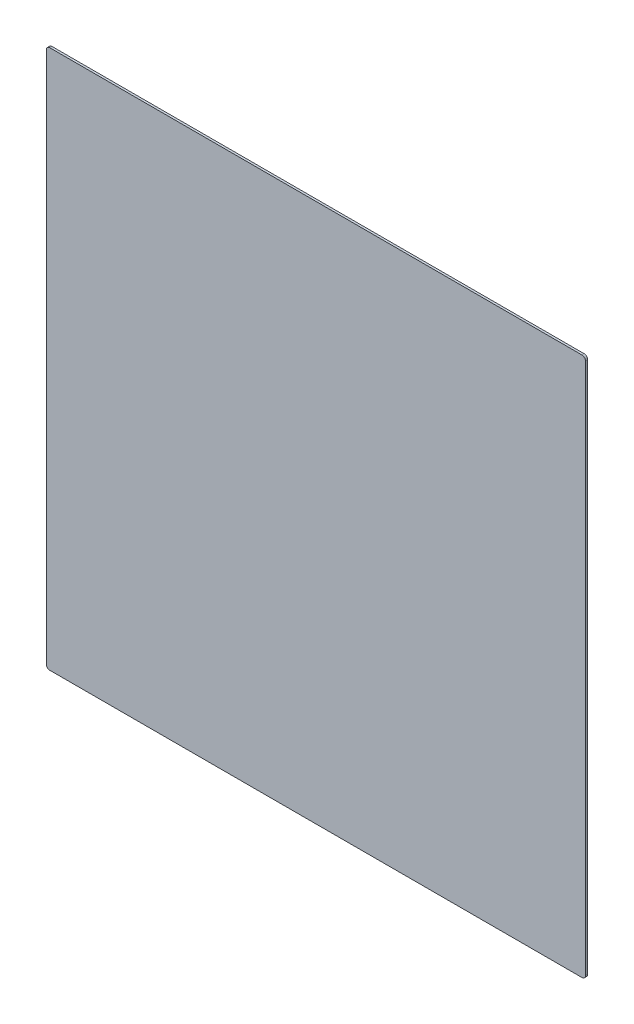
ISO-10303-21;
HEADER;
FILE_DESCRIPTION(('STEP AP214'),'2;1');
FILE_NAME('part.step','',(''),(''),'','','');
FILE_SCHEMA(('AUTOMOTIVE_DESIGN { 1 0 10303 214 1 1 1 1 }'));
ENDSEC;
DATA;
#1=APPLICATION_CONTEXT('core data for automotive mechanical design processes');
#2=APPLICATION_PROTOCOL_DEFINITION('international standard','automotive_design',2000,#1);
#3=PRODUCT_CONTEXT('',#1,'mechanical');
#4=PRODUCT('Part','Part','',(#3));
#5=PRODUCT_RELATED_PRODUCT_CATEGORY('part','',(#4));
#6=PRODUCT_DEFINITION_FORMATION('','',#4);
#7=PRODUCT_DEFINITION_CONTEXT('part definition',#1,'design');
#8=PRODUCT_DEFINITION('design','',#6,#7);
#9=PRODUCT_DEFINITION_SHAPE('','',#8);
#10=(LENGTH_UNIT() NAMED_UNIT(*) SI_UNIT(.MILLI.,.METRE.));
#11=(NAMED_UNIT(*) PLANE_ANGLE_UNIT() SI_UNIT($,.RADIAN.));
#12=(NAMED_UNIT(*) SI_UNIT($,.STERADIAN.) SOLID_ANGLE_UNIT());
#13=UNCERTAINTY_MEASURE_WITH_UNIT(LENGTH_MEASURE(1.E-05),#10,'distance_accuracy_value','');
#14=(GEOMETRIC_REPRESENTATION_CONTEXT(3) GLOBAL_UNCERTAINTY_ASSIGNED_CONTEXT((#13)) GLOBAL_UNIT_ASSIGNED_CONTEXT((#10,
#11,#12)) REPRESENTATION_CONTEXT('',''));
#15=CARTESIAN_POINT('',(0.,0.,0.));
#16=DIRECTION('',(0.,0.,1.));
#17=DIRECTION('',(1.,0.,0.));
#18=AXIS2_PLACEMENT_3D('',#15,#16,#17);
#19=CARTESIAN_POINT('',(152.5,152.5,1.25));
#20=DIRECTION('',(-1.,0.,0.));
#21=DIRECTION('',(0.,-1.,0.));
#22=AXIS2_PLACEMENT_3D('',#19,#20,#21);
#23=PLANE('',#22);
#24=DIRECTION('',(0.,1.,0.));
#25=VECTOR('',#24,1.);
#26=CARTESIAN_POINT('',(152.5,152.5,1.25));
#27=LINE('',#26,#25);
#28=CARTESIAN_POINT('',(152.5,-150.5,1.25));
#29=VERTEX_POINT('',#28);
#30=CARTESIAN_POINT('',(152.5,150.5,1.25));
#31=VERTEX_POINT('',#30);
#32=EDGE_CURVE('E124',#29,#31,#27,.T.);
#33=ORIENTED_EDGE('',*,*,#32,.F.);
#34=DIRECTION('',(0.,0.,-1.));
#35=VECTOR('',#34,1.);
#36=CARTESIAN_POINT('',(152.5,-150.5,1.25));
#37=LINE('',#36,#35);
#38=CARTESIAN_POINT('',(152.5,-150.5,0.));
#39=VERTEX_POINT('',#38);
#40=EDGE_CURVE('E150',#29,#39,#37,.T.);
#41=ORIENTED_EDGE('',*,*,#40,.T.);
#42=DIRECTION('',(0.,1.,0.));
#43=VECTOR('',#42,1.);
#44=CARTESIAN_POINT('',(152.5,152.5,0.));
#45=LINE('',#44,#43);
#46=CARTESIAN_POINT('',(152.5,150.5,0.));
#47=VERTEX_POINT('',#46);
#48=EDGE_CURVE('E158',#39,#47,#45,.T.);
#49=ORIENTED_EDGE('',*,*,#48,.T.);
#50=DIRECTION('',(0.,0.,-1.));
#51=VECTOR('',#50,1.);
#52=CARTESIAN_POINT('',(152.5,150.5,1.25));
#53=LINE('',#52,#51);
#54=EDGE_CURVE('E148',#47,#31,#53,.F.);
#55=ORIENTED_EDGE('',*,*,#54,.T.);
#56=EDGE_LOOP('',(#33,#41,#49,#55));
#57=FACE_BOUND('',#56,.T.);
#58=ADVANCED_FACE('F33',(#57),#23,.F.);
#59=CARTESIAN_POINT('',(-152.5,152.5,1.25));
#60=DIRECTION('',(0.,-1.,0.));
#61=DIRECTION('',(0.,0.,-1.));
#62=AXIS2_PLACEMENT_3D('',#59,#60,#61);
#63=PLANE('',#62);
#64=DIRECTION('',(-1.,0.,0.));
#65=VECTOR('',#64,1.);
#66=CARTESIAN_POINT('',(-152.5,152.5,0.));
#67=LINE('',#66,#65);
#68=CARTESIAN_POINT('',(150.5,152.5,0.));
#69=VERTEX_POINT('',#68);
#70=CARTESIAN_POINT('',(-150.5,152.5,0.));
#71=VERTEX_POINT('',#70);
#72=EDGE_CURVE('E129',#69,#71,#67,.T.);
#73=ORIENTED_EDGE('',*,*,#72,.T.);
#74=DIRECTION('',(0.,0.,-1.));
#75=VECTOR('',#74,1.);
#76=CARTESIAN_POINT('',(-150.5,152.5,1.25));
#77=LINE('',#76,#75);
#78=CARTESIAN_POINT('',(-150.5,152.5,1.25));
#79=VERTEX_POINT('',#78);
#80=EDGE_CURVE('E11',#71,#79,#77,.F.);
#81=ORIENTED_EDGE('',*,*,#80,.T.);
#82=DIRECTION('',(-1.,0.,0.));
#83=VECTOR('',#82,1.);
#84=CARTESIAN_POINT('',(-152.5,152.5,1.25));
#85=LINE('',#84,#83);
#86=CARTESIAN_POINT('',(150.5,152.5,1.25));
#87=VERTEX_POINT('',#86);
#88=EDGE_CURVE('E127',#87,#79,#85,.T.);
#89=ORIENTED_EDGE('',*,*,#88,.F.);
#90=DIRECTION('',(0.,0.,-1.));
#91=VECTOR('',#90,1.);
#92=CARTESIAN_POINT('',(150.5,152.5,1.25));
#93=LINE('',#92,#91);
#94=EDGE_CURVE('E41',#87,#69,#93,.T.);
#95=ORIENTED_EDGE('',*,*,#94,.T.);
#96=EDGE_LOOP('',(#73,#81,#89,#95));
#97=FACE_BOUND('',#96,.T.);
#98=ADVANCED_FACE('F155',(#97),#63,.F.);
#99=CARTESIAN_POINT('',(-152.5,152.5,1.25));
#100=DIRECTION('',(1.,0.,0.));
#101=DIRECTION('',(0.,0.,-1.));
#102=AXIS2_PLACEMENT_3D('',#99,#100,#101);
#103=PLANE('',#102);
#104=DIRECTION('',(0.,-1.,0.));
#105=VECTOR('',#104,1.);
#106=CARTESIAN_POINT('',(-152.5,152.5,0.));
#107=LINE('',#106,#105);
#108=CARTESIAN_POINT('',(-152.5,150.5,0.));
#109=VERTEX_POINT('',#108);
#110=CARTESIAN_POINT('',(-152.5,-150.5,0.));
#111=VERTEX_POINT('',#110);
#112=EDGE_CURVE('E125',#109,#111,#107,.T.);
#113=ORIENTED_EDGE('',*,*,#112,.T.);
#114=DIRECTION('',(0.,0.,-1.));
#115=VECTOR('',#114,1.);
#116=CARTESIAN_POINT('',(-152.5,-150.5,1.25));
#117=LINE('',#116,#115);
#118=CARTESIAN_POINT('',(-152.5,-150.5,1.25));
#119=VERTEX_POINT('',#118);
#120=EDGE_CURVE('E103',#111,#119,#117,.F.);
#121=ORIENTED_EDGE('',*,*,#120,.T.);
#122=DIRECTION('',(0.,-1.,0.));
#123=VECTOR('',#122,1.);
#124=CARTESIAN_POINT('',(-152.5,152.5,1.25));
#125=LINE('',#124,#123);
#126=CARTESIAN_POINT('',(-152.5,150.5,1.25));
#127=VERTEX_POINT('',#126);
#128=EDGE_CURVE('E162',#127,#119,#125,.T.);
#129=ORIENTED_EDGE('',*,*,#128,.F.);
#130=DIRECTION('',(0.,0.,-1.));
#131=VECTOR('',#130,1.);
#132=CARTESIAN_POINT('',(-152.5,150.5,1.25));
#133=LINE('',#132,#131);
#134=EDGE_CURVE('E108',#127,#109,#133,.T.);
#135=ORIENTED_EDGE('',*,*,#134,.T.);
#136=EDGE_LOOP('',(#113,#121,#129,#135));
#137=FACE_BOUND('',#136,.T.);
#138=ADVANCED_FACE('F172',(#137),#103,.F.);
#139=CARTESIAN_POINT('',(-152.5,-152.5,1.25));
#140=DIRECTION('',(0.,1.,0.));
#141=DIRECTION('',(0.,0.,1.));
#142=AXIS2_PLACEMENT_3D('',#139,#140,#141);
#143=PLANE('',#142);
#144=DIRECTION('',(1.,0.,0.));
#145=VECTOR('',#144,1.);
#146=CARTESIAN_POINT('',(-152.5,-152.5,1.25));
#147=LINE('',#146,#145);
#148=CARTESIAN_POINT('',(-150.5,-152.5,1.25));
#149=VERTEX_POINT('',#148);
#150=CARTESIAN_POINT('',(150.5,-152.5,1.25));
#151=VERTEX_POINT('',#150);
#152=EDGE_CURVE('E118',#149,#151,#147,.T.);
#153=ORIENTED_EDGE('',*,*,#152,.F.);
#154=DIRECTION('',(0.,0.,-1.));
#155=VECTOR('',#154,1.);
#156=CARTESIAN_POINT('',(-150.5,-152.5,1.25));
#157=LINE('',#156,#155);
#158=CARTESIAN_POINT('',(-150.5,-152.5,0.));
#159=VERTEX_POINT('',#158);
#160=EDGE_CURVE('E102',#149,#159,#157,.T.);
#161=ORIENTED_EDGE('',*,*,#160,.T.);
#162=DIRECTION('',(1.,0.,0.));
#163=VECTOR('',#162,1.);
#164=CARTESIAN_POINT('',(-152.5,-152.5,0.));
#165=LINE('',#164,#163);
#166=CARTESIAN_POINT('',(150.5,-152.5,0.));
#167=VERTEX_POINT('',#166);
#168=EDGE_CURVE('E115',#159,#167,#165,.T.);
#169=ORIENTED_EDGE('',*,*,#168,.T.);
#170=DIRECTION('',(0.,0.,-1.));
#171=VECTOR('',#170,1.);
#172=CARTESIAN_POINT('',(150.5,-152.5,1.25));
#173=LINE('',#172,#171);
#174=EDGE_CURVE('E120',#167,#151,#173,.F.);
#175=ORIENTED_EDGE('',*,*,#174,.T.);
#176=EDGE_LOOP('',(#153,#161,#169,#175));
#177=FACE_BOUND('',#176,.T.);
#178=ADVANCED_FACE('F114',(#177),#143,.F.);
#179=CARTESIAN_POINT('',(0.,0.,1.25));
#180=DIRECTION('',(0.,0.,1.));
#181=DIRECTION('',(1.,0.,0.));
#182=AXIS2_PLACEMENT_3D('',#179,#180,#181);
#183=PLANE('',#182);
#184=ORIENTED_EDGE('',*,*,#128,.T.);
#185=CARTESIAN_POINT('',(-150.5,-150.5,1.25));
#186=DIRECTION('',(0.,0.,1.));
#187=DIRECTION('',(1.,0.,0.));
#188=AXIS2_PLACEMENT_3D('',#185,#186,#187);
#189=CIRCLE('',#188,2.);
#190=EDGE_CURVE('E146',#119,#149,#189,.T.);
#191=ORIENTED_EDGE('',*,*,#190,.T.);
#192=ORIENTED_EDGE('',*,*,#152,.T.);
#193=CARTESIAN_POINT('',(150.5,-150.5,1.25));
#194=DIRECTION('',(0.,0.,1.));
#195=DIRECTION('',(1.,0.,0.));
#196=AXIS2_PLACEMENT_3D('',#193,#194,#195);
#197=CIRCLE('',#196,2.);
#198=EDGE_CURVE('E144',#151,#29,#197,.T.);
#199=ORIENTED_EDGE('',*,*,#198,.T.);
#200=ORIENTED_EDGE('',*,*,#32,.T.);
#201=CARTESIAN_POINT('',(150.5,150.5,1.25));
#202=DIRECTION('',(0.,0.,1.));
#203=DIRECTION('',(1.,0.,0.));
#204=AXIS2_PLACEMENT_3D('',#201,#202,#203);
#205=CIRCLE('',#204,2.);
#206=EDGE_CURVE('E53',#31,#87,#205,.T.);
#207=ORIENTED_EDGE('',*,*,#206,.T.);
#208=ORIENTED_EDGE('',*,*,#88,.T.);
#209=CARTESIAN_POINT('',(-150.5,150.5,1.25));
#210=DIRECTION('',(0.,0.,1.));
#211=DIRECTION('',(1.,0.,0.));
#212=AXIS2_PLACEMENT_3D('',#209,#210,#211);
#213=CIRCLE('',#212,2.);
#214=EDGE_CURVE('E142',#79,#127,#213,.T.);
#215=ORIENTED_EDGE('',*,*,#214,.T.);
#216=EDGE_LOOP('',(#184,#191,#192,#199,#200,#207,#208,#215));
#217=FACE_BOUND('',#216,.T.);
#218=ADVANCED_FACE('F166',(#217),#183,.T.);
#219=CARTESIAN_POINT('',(0.,0.,0.));
#220=DIRECTION('',(0.,0.,1.));
#221=DIRECTION('',(1.,0.,0.));
#222=AXIS2_PLACEMENT_3D('',#219,#220,#221);
#223=PLANE('',#222);
#224=ORIENTED_EDGE('',*,*,#168,.F.);
#225=CARTESIAN_POINT('',(-150.5,-150.5,0.));
#226=DIRECTION('',(0.,0.,1.));
#227=DIRECTION('',(1.,0.,0.));
#228=AXIS2_PLACEMENT_3D('',#225,#226,#227);
#229=CIRCLE('',#228,2.);
#230=EDGE_CURVE('E98',#159,#111,#229,.F.);
#231=ORIENTED_EDGE('',*,*,#230,.T.);
#232=ORIENTED_EDGE('',*,*,#112,.F.);
#233=CARTESIAN_POINT('',(-150.5,150.5,0.));
#234=DIRECTION('',(0.,0.,1.));
#235=DIRECTION('',(1.,0.,0.));
#236=AXIS2_PLACEMENT_3D('',#233,#234,#235);
#237=CIRCLE('',#236,2.);
#238=EDGE_CURVE('E135',#109,#71,#237,.F.);
#239=ORIENTED_EDGE('',*,*,#238,.T.);
#240=ORIENTED_EDGE('',*,*,#72,.F.);
#241=CARTESIAN_POINT('',(150.5,150.5,0.));
#242=DIRECTION('',(0.,0.,1.));
#243=DIRECTION('',(1.,0.,0.));
#244=AXIS2_PLACEMENT_3D('',#241,#242,#243);
#245=CIRCLE('',#244,2.);
#246=EDGE_CURVE('E119',#69,#47,#245,.F.);
#247=ORIENTED_EDGE('',*,*,#246,.T.);
#248=ORIENTED_EDGE('',*,*,#48,.F.);
#249=CARTESIAN_POINT('',(150.5,-150.5,0.));
#250=DIRECTION('',(0.,0.,1.));
#251=DIRECTION('',(1.,0.,0.));
#252=AXIS2_PLACEMENT_3D('',#249,#250,#251);
#253=CIRCLE('',#252,2.);
#254=EDGE_CURVE('E109',#39,#167,#253,.F.);
#255=ORIENTED_EDGE('',*,*,#254,.T.);
#256=EDGE_LOOP('',(#224,#231,#232,#239,#240,#247,#248,#255));
#257=FACE_BOUND('',#256,.T.);
#258=ADVANCED_FACE('F122',(#257),#223,.F.);
#259=CARTESIAN_POINT('',(-150.5,-150.5,1.25));
#260=DIRECTION('',(0.,0.,-1.));
#261=DIRECTION('',(-1.,0.,0.));
#262=AXIS2_PLACEMENT_3D('',#259,#260,#261);
#263=CYLINDRICAL_SURFACE('',#262,2.);
#264=ORIENTED_EDGE('',*,*,#190,.F.);
#265=ORIENTED_EDGE('',*,*,#120,.F.);
#266=ORIENTED_EDGE('',*,*,#230,.F.);
#267=ORIENTED_EDGE('',*,*,#160,.F.);
#268=EDGE_LOOP('',(#264,#265,#266,#267));
#269=FACE_BOUND('',#268,.T.);
#270=ADVANCED_FACE('F101',(#269),#263,.T.);
#271=CARTESIAN_POINT('',(150.5,-150.5,1.25));
#272=DIRECTION('',(0.,0.,-1.));
#273=DIRECTION('',(-1.,0.,0.));
#274=AXIS2_PLACEMENT_3D('',#271,#272,#273);
#275=CYLINDRICAL_SURFACE('',#274,2.);
#276=ORIENTED_EDGE('',*,*,#198,.F.);
#277=ORIENTED_EDGE('',*,*,#174,.F.);
#278=ORIENTED_EDGE('',*,*,#254,.F.);
#279=ORIENTED_EDGE('',*,*,#40,.F.);
#280=EDGE_LOOP('',(#276,#277,#278,#279));
#281=FACE_BOUND('',#280,.T.);
#282=ADVANCED_FACE('F177',(#281),#275,.T.);
#283=CARTESIAN_POINT('',(-150.5,150.5,1.25));
#284=DIRECTION('',(0.,0.,-1.));
#285=DIRECTION('',(-1.,0.,0.));
#286=AXIS2_PLACEMENT_3D('',#283,#284,#285);
#287=CYLINDRICAL_SURFACE('',#286,2.);
#288=ORIENTED_EDGE('',*,*,#214,.F.);
#289=ORIENTED_EDGE('',*,*,#80,.F.);
#290=ORIENTED_EDGE('',*,*,#238,.F.);
#291=ORIENTED_EDGE('',*,*,#134,.F.);
#292=EDGE_LOOP('',(#288,#289,#290,#291));
#293=FACE_BOUND('',#292,.T.);
#294=ADVANCED_FACE('F170',(#293),#287,.T.);
#295=CARTESIAN_POINT('',(150.5,150.5,1.25));
#296=DIRECTION('',(0.,0.,-1.));
#297=DIRECTION('',(-1.,0.,0.));
#298=AXIS2_PLACEMENT_3D('',#295,#296,#297);
#299=CYLINDRICAL_SURFACE('',#298,2.);
#300=ORIENTED_EDGE('',*,*,#206,.F.);
#301=ORIENTED_EDGE('',*,*,#54,.F.);
#302=ORIENTED_EDGE('',*,*,#246,.F.);
#303=ORIENTED_EDGE('',*,*,#94,.F.);
#304=EDGE_LOOP('',(#300,#301,#302,#303));
#305=FACE_BOUND('',#304,.T.);
#306=ADVANCED_FACE('F35',(#305),#299,.T.);
#307=CLOSED_SHELL('',(#58,#98,#138,#178,#218,#258,#270,#282,#294,#306));
#308=MANIFOLD_SOLID_BREP('B2',#307);
#309=ADVANCED_BREP_SHAPE_REPRESENTATION('',(#18,#308),#14);
#310=SHAPE_DEFINITION_REPRESENTATION(#9,#309);
ENDSEC;
END-ISO-10303-21;
